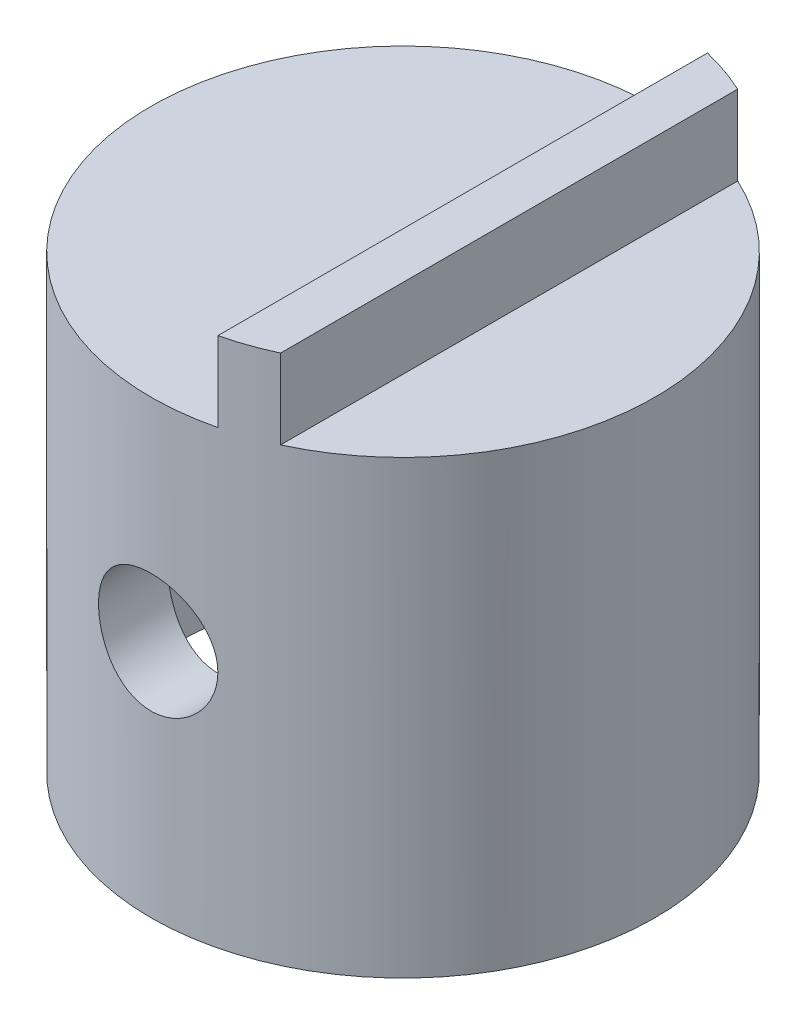
ISO-10303-21;
HEADER;
FILE_DESCRIPTION(('STEP AP214'),'2;1');
FILE_NAME('part.step','',(''),(''),'','','');
FILE_SCHEMA(('AUTOMOTIVE_DESIGN { 1 0 10303 214 1 1 1 1 }'));
ENDSEC;
DATA;
#1=APPLICATION_CONTEXT('core data for automotive mechanical design processes');
#2=APPLICATION_PROTOCOL_DEFINITION('international standard','automotive_design',2000,#1);
#3=PRODUCT_CONTEXT('',#1,'mechanical');
#4=PRODUCT('Part','Part','',(#3));
#5=PRODUCT_RELATED_PRODUCT_CATEGORY('part','',(#4));
#6=PRODUCT_DEFINITION_FORMATION('','',#4);
#7=PRODUCT_DEFINITION_CONTEXT('part definition',#1,'design');
#8=PRODUCT_DEFINITION('design','',#6,#7);
#9=PRODUCT_DEFINITION_SHAPE('','',#8);
#10=(LENGTH_UNIT() NAMED_UNIT(*) SI_UNIT(.MILLI.,.METRE.));
#11=(NAMED_UNIT(*) PLANE_ANGLE_UNIT() SI_UNIT($,.RADIAN.));
#12=(NAMED_UNIT(*) SI_UNIT($,.STERADIAN.) SOLID_ANGLE_UNIT());
#13=UNCERTAINTY_MEASURE_WITH_UNIT(LENGTH_MEASURE(1.E-05),#10,'distance_accuracy_value','');
#14=(GEOMETRIC_REPRESENTATION_CONTEXT(3) GLOBAL_UNCERTAINTY_ASSIGNED_CONTEXT((#13)) GLOBAL_UNIT_ASSIGNED_CONTEXT((#10,
#11,#12)) REPRESENTATION_CONTEXT('',''));
#15=CARTESIAN_POINT('',(0.,0.,0.));
#16=DIRECTION('',(0.,0.,1.));
#17=DIRECTION('',(1.,0.,0.));
#18=AXIS2_PLACEMENT_3D('',#15,#16,#17);
#19=CARTESIAN_POINT('',(0.,17.,0.));
#20=DIRECTION('',(0.,1.,0.));
#21=DIRECTION('',(0.,0.,1.));
#22=AXIS2_PLACEMENT_3D('',#19,#20,#21);
#23=PLANE('',#22);
#24=DIRECTION('',(0.,0.,1.));
#25=VECTOR('',#24,1.);
#26=CARTESIAN_POINT('',(2.25,17.,-9.22970747098737));
#27=LINE('',#26,#25);
#28=CARTESIAN_POINT('',(2.25,17.,-9.22970747098737));
#29=VERTEX_POINT('',#28);
#30=CARTESIAN_POINT('',(2.25,17.,9.22970747098737));
#31=VERTEX_POINT('',#30);
#32=EDGE_CURVE('E55',#29,#31,#27,.T.);
#33=ORIENTED_EDGE('',*,*,#32,.F.);
#34=CARTESIAN_POINT('',(0.,17.,0.));
#35=DIRECTION('',(0.,1.,0.));
#36=DIRECTION('',(0.,0.,1.));
#37=AXIS2_PLACEMENT_3D('',#34,#35,#36);
#38=CIRCLE('',#37,9.5);
#39=EDGE_CURVE('E48',#29,#31,#38,.T.);
#40=ORIENTED_EDGE('',*,*,#39,.T.);
#41=EDGE_LOOP('',(#33,#40));
#42=FACE_BOUND('',#41,.T.);
#43=ADVANCED_FACE('F34',(#42),#23,.T.);
#44=CARTESIAN_POINT('',(0.,17.,0.));
#45=DIRECTION('',(0.,-1.,0.));
#46=DIRECTION('',(0.,0.,-1.));
#47=AXIS2_PLACEMENT_3D('',#44,#45,#46);
#48=CYLINDRICAL_SURFACE('',#47,9.5);
#49=CARTESIAN_POINT('',(0.,11.25,-9.5));
#50=CARTESIAN_POINT('',(-0.124521863897175,11.2499961503737,-9.49999778014591));
#51=CARTESIAN_POINT('',(-0.249088188404821,11.2396280309679,-9.49752712494055));
#52=CARTESIAN_POINT('',(-0.494664576527935,11.1984832616561,-9.48791023805947));
#53=CARTESIAN_POINT('',(-0.615672345520305,11.1676937324657,-9.480761055789));
#54=CARTESIAN_POINT('',(-0.850548627564486,11.0867387890331,-9.46258067842105));
#55=CARTESIAN_POINT('',(-0.964425063268532,11.0365953366348,-9.4515538846956));
#56=CARTESIAN_POINT('',(-1.1821477312082,10.9184299778384,-9.42679946613872));
#57=CARTESIAN_POINT('',(-1.28599388095224,10.8504079244192,-9.41307181909763));
#58=CARTESIAN_POINT('',(-1.48264397629712,10.6970769106558,-9.38412604548802));
#59=CARTESIAN_POINT('',(-1.57523442101544,10.6114980905591,-9.36888684685691));
#60=CARTESIAN_POINT('',(-1.74489104921866,10.4260612689178,-9.33877914520377));
#61=CARTESIAN_POINT('',(-1.821955648573,10.3262018120692,-9.32391068014384));
#62=CARTESIAN_POINT('',(-1.95934991517716,10.1134151404372,-9.29601760977212));
#63=CARTESIAN_POINT('',(-2.01944579157401,10.0003331298744,-9.28301986999367));
#64=CARTESIAN_POINT('',(-2.11969493785631,9.76531519968497,-9.26064519500415));
#65=CARTESIAN_POINT('',(-2.15985104023712,9.64338054042174,-9.25126774556381));
#66=CARTESIAN_POINT('',(-2.21836228054517,9.39645286169196,-9.23741117131147));
#67=CARTESIAN_POINT('',(-2.23709879698116,9.27155512227433,-9.23284647317642));
#68=CARTESIAN_POINT('',(-2.25342606419925,9.02031209493352,-9.22887572555513));
#69=CARTESIAN_POINT('',(-2.25101988347755,8.89396701972415,-9.22946892748892));
#70=CARTESIAN_POINT('',(-2.22543548348135,8.64629988926208,-9.23566979032183));
#71=CARTESIAN_POINT('',(-2.20270665796191,8.52492827594527,-9.24116895989923));
#72=CARTESIAN_POINT('',(-2.13783689546698,8.28777156774136,-9.25638984362656));
#73=CARTESIAN_POINT('',(-2.09569470270775,8.17198683478559,-9.26611183093367));
#74=CARTESIAN_POINT('',(-1.99279869774224,7.94806023440692,-9.28878568097973));
#75=CARTESIAN_POINT('',(-1.93187758767104,7.8399982830018,-9.30176637375997));
#76=CARTESIAN_POINT('',(-1.79327033578444,7.63546751244213,-9.32947816196242));
#77=CARTESIAN_POINT('',(-1.71558153997627,7.5390005323096,-9.34420953431648));
#78=CARTESIAN_POINT('',(-1.54329409824453,7.35781733727136,-9.37422345419306));
#79=CARTESIAN_POINT('',(-1.44831491575896,7.27346330467785,-9.38951047988488));
#80=CARTESIAN_POINT('',(-1.24537916830417,7.12181587652219,-9.41857321261228));
#81=CARTESIAN_POINT('',(-1.13742228285395,7.05452290240607,-9.43234888230924));
#82=CARTESIAN_POINT('',(-0.91111154359382,6.93879402183447,-9.45689433098136));
#83=CARTESIAN_POINT('',(-0.792729156295195,6.89041197005719,-9.46765550093533));
#84=CARTESIAN_POINT('',(-0.549201333713713,6.81433220959535,-9.48489637393271));
#85=CARTESIAN_POINT('',(-0.424057059962553,6.78663096047621,-9.49137680979131));
#86=CARTESIAN_POINT('',(-0.173658792784368,6.75324074591316,-9.49921939695592));
#87=CARTESIAN_POINT('',(-0.0484741576005757,6.74705791834838,-9.50069635980613));
#88=CARTESIAN_POINT('',(0.201140016084546,6.75553247877613,-9.49869029177098));
#89=CARTESIAN_POINT('',(0.325569614370746,6.77018819453545,-9.49520765887889));
#90=CARTESIAN_POINT('',(0.568460248232152,6.81951553813045,-9.4837468124882));
#91=CARTESIAN_POINT('',(0.686978142300745,6.85392226398561,-9.47582812887723));
#92=CARTESIAN_POINT('',(0.916557060159028,6.94147610741373,-9.45638449562114));
#93=CARTESIAN_POINT('',(1.0276173772562,6.99462499805073,-9.44485920479196));
#94=CARTESIAN_POINT('',(1.24112733534557,7.11914270868345,-9.41920188626547));
#95=CARTESIAN_POINT('',(1.3434073704625,7.19079404755374,-9.40503047757712));
#96=CARTESIAN_POINT('',(1.53466832411548,7.34991696514335,-9.37572244408147));
#97=CARTESIAN_POINT('',(1.6236471919022,7.4373909787881,-9.36058567094826));
#98=CARTESIAN_POINT('',(1.78777973532984,7.62795851967428,-9.3306467718057));
#99=CARTESIAN_POINT('',(1.86258876989616,7.73135162457607,-9.31585918897744));
#100=CARTESIAN_POINT('',(1.99378826449349,7.9495200545043,-9.28866596427086));
#101=CARTESIAN_POINT('',(2.05017954851867,8.06429487002332,-9.27626021584158));
#102=CARTESIAN_POINT('',(2.1425353233304,8.30134206769248,-9.25536523639409));
#103=CARTESIAN_POINT('',(2.17861982562254,8.42356556574479,-9.24685305191906));
#104=CARTESIAN_POINT('',(2.22967178760064,8.67257324168974,-9.23467732604892));
#105=CARTESIAN_POINT('',(2.24464331035334,8.79935653725922,-9.23101285174936));
#106=CARTESIAN_POINT('',(2.25284878770318,9.05039254447698,-9.22901328645058));
#107=CARTESIAN_POINT('',(2.24663152566523,9.17462654991455,-9.23054364662708));
#108=CARTESIAN_POINT('',(2.21387919741185,9.42022140489971,-9.2384531896562));
#109=CARTESIAN_POINT('',(2.1873444615991,9.54158230113671,-9.24483229365854));
#110=CARTESIAN_POINT('',(2.11499553513759,9.77745934507233,-9.26164956320364));
#111=CARTESIAN_POINT('',(2.06927425452472,9.89200548082024,-9.27206814947007));
#112=CARTESIAN_POINT('',(1.95992558249034,10.1118779176285,-9.29579518171453));
#113=CARTESIAN_POINT('',(1.89629596759437,10.217203071694,-9.30910398649127));
#114=CARTESIAN_POINT('',(1.75117307375904,10.4183192487892,-9.33750352912181));
#115=CARTESIAN_POINT('',(1.66929443462535,10.5138273683894,-9.35262884729911));
#116=CARTESIAN_POINT('',(1.49076199952812,10.6899271999249,-9.38273993278095));
#117=CARTESIAN_POINT('',(1.39410474872197,10.7705154142224,-9.39772566658308));
#118=CARTESIAN_POINT('',(1.18691678623682,10.9157200326945,-9.42615092989844));
#119=CARTESIAN_POINT('',(1.07619106258127,10.9800640655305,-9.43956229939399));
#120=CARTESIAN_POINT('',(0.845192664111041,11.0891231515422,-9.46303764495673));
#121=CARTESIAN_POINT('',(0.724927431846853,11.1338533326299,-9.4731041993799));
#122=CARTESIAN_POINT('',(0.503935029059565,11.1951873592208,-9.48713151542475));
#123=CARTESIAN_POINT('',(0.404327135141075,11.215700009255,-9.49192549926781));
#124=CARTESIAN_POINT('',(0.203155946656892,11.2431074888882,-9.49836055191313));
#125=CARTESIAN_POINT('',(0.101592770537468,11.2500031407674,-9.50000181109663));
#126=CARTESIAN_POINT('',(0.,11.25,-9.5));
#127=B_SPLINE_CURVE_WITH_KNOTS('',3,(#49,#50,#51,#52,#53,#54,#55,#56,#57,#58,#59,#60,#61,#62,
#63,#64,#65,#66,#67,#68,#69,#70,#71,#72,#73,#74,#75,#76,#77,#78,#79,#80,#81,#82,#83,#84,#85,#86,
#87,#88,#89,#90,#91,#92,#93,#94,#95,#96,#97,#98,#99,#100,#101,#102,#103,#104,#105,#106,#107,
#108,#109,#110,#111,#112,#113,#114,#115,#116,#117,#118,#119,#120,#121,#122,#123,#124,#125,#126),
.UNSPECIFIED.,.T.,.F.,(4,2,2,2,2,2,2,2,2,2,2,2,2,2,2,2,2,2,2,2,2,2,2,2,2,2,2,2,2,2,2,2,2,2,2,2,
2,2,4),(0.,0.373193483221535,0.74662255454218,1.11962911755113,1.49263874799856,
1.87188109444781,2.25116211611593,2.63543877469475,3.01966083017445,3.39692966377169,
3.77414374423823,4.1432173169321,4.51231476707498,4.88480042053213,5.25734507438841,
5.63938537386875,6.02143510967362,6.40456505791057,6.787629401452,7.16184200180051,
7.53602457435784,7.90530208176371,8.27461453328679,8.64993905381035,9.02532138162226,
9.40890751099062,9.792476476697,10.1737541106674,10.554958360018,10.9263653619244,
11.2977663241397,11.6673891763827,12.0370579407576,12.4154314111572,12.7938934707404,
13.178333160474,13.5624758130099,13.8669689228978,14.1714436450102),.UNSPECIFIED.);
#128=CARTESIAN_POINT('',(0.,11.25,-9.5));
#129=VERTEX_POINT('',#128);
#130=EDGE_CURVE('E186',#129,#129,#127,.T.);
#131=ORIENTED_EDGE('',*,*,#130,.T.);
#132=EDGE_LOOP('',(#131));
#133=FACE_BOUND('',#132,.T.);
#134=CARTESIAN_POINT('',(2.25,9.,9.22970747098737));
#135=CARTESIAN_POINT('',(2.24999611442214,8.87553336355061,9.22970994318355));
#136=CARTESIAN_POINT('',(2.23963687591516,8.75102218457137,9.2322526667603));
#137=CARTESIAN_POINT('',(2.19853057414555,8.50556022943455,9.24212606879303));
#138=CARTESIAN_POINT('',(2.16777040134303,8.3846117949079,9.24945982589811));
#139=CARTESIAN_POINT('',(2.08690125560379,8.14986129794313,9.26803917163333));
#140=CARTESIAN_POINT('',(2.0368156166606,8.03605080891436,9.27928004111279));
#141=CARTESIAN_POINT('',(1.91878661569883,7.81843969925569,9.30440126752905));
#142=CARTESIAN_POINT('',(1.85084297942545,7.71463923238852,9.31828166500159));
#143=CARTESIAN_POINT('',(1.6975930507226,7.51794201822874,9.34742493993943));
#144=CARTESIAN_POINT('',(1.61199925402773,7.42527222208057,9.36270802627148));
#145=CARTESIAN_POINT('',(1.42649860107276,7.25546117445896,9.39275866444044));
#146=CARTESIAN_POINT('',(1.32659050999692,7.17832126404585,9.40752617166434));
#147=CARTESIAN_POINT('',(1.11375682043015,7.04084453461498,9.43510385208277));
#148=CARTESIAN_POINT('',(1.00068476430616,6.98072864991775,9.4478873949159));
#149=CARTESIAN_POINT('',(0.765688234861397,6.88043982061273,9.46982722490012));
#150=CARTESIAN_POINT('',(0.643764932650029,6.84026424319296,9.47898399087924));
#151=CARTESIAN_POINT('',(0.396890345908396,6.78171770480134,9.49249570840639));
#152=CARTESIAN_POINT('',(0.272035044849089,6.76296187866105,9.49693531180509));
#153=CARTESIAN_POINT('',(0.0208764710934931,6.74658125761243,9.50080673419306));
#154=CARTESIAN_POINT('',(-0.10542660639136,6.74895364658073,9.50023922056768));
#155=CARTESIAN_POINT('',(-0.353233250933663,6.77448101292812,9.49422410135968));
#156=CARTESIAN_POINT('',(-0.47478230382587,6.79722083262706,9.48887398574258));
#157=CARTESIAN_POINT('',(-0.712288042033562,6.86217275878706,9.47400722984977));
#158=CARTESIAN_POINT('',(-0.828244447485218,6.90438583860264,9.46449038130462));
#159=CARTESIAN_POINT('',(-1.05239259196534,7.00743542216372,9.44220698787272));
#160=CARTESIAN_POINT('',(-1.16051176333364,7.06842383766035,9.42941408379165));
#161=CARTESIAN_POINT('',(-1.3651291884166,7.2071785218519,9.40197295463057));
#162=CARTESIAN_POINT('',(-1.46162560471189,7.28494743793408,9.38732443694914));
#163=CARTESIAN_POINT('',(-1.6427317853729,7.45729656759466,9.35735402725222));
#164=CARTESIAN_POINT('',(-1.7269950581515,7.5522398970957,9.34202442361494));
#165=CARTESIAN_POINT('',(-1.87847580464742,7.75507002465211,9.3127492245575));
#166=CARTESIAN_POINT('',(-1.94569263989652,7.86295730729572,9.29880368098871));
#167=CARTESIAN_POINT('',(-2.06136414788159,8.08923993805708,9.27385084359881));
#168=CARTESIAN_POINT('',(-2.10974329479851,8.20767529310845,9.26285543136379));
#169=CARTESIAN_POINT('',(-2.1858014959774,8.45131950439211,9.2452048394907));
#170=CARTESIAN_POINT('',(-2.21348447098912,8.57652707285239,9.23854883781126));
#171=CARTESIAN_POINT('',(-2.24680609562283,8.82696874563311,9.23050116754752));
#172=CARTESIAN_POINT('',(-2.25295365178635,8.95213131536519,9.22898799421141));
#173=CARTESIAN_POINT('',(-2.24441646736499,9.20169329827535,9.23106785829184));
#174=CARTESIAN_POINT('',(-2.22973342849409,9.32609277295919,9.23466047860078));
#175=CARTESIAN_POINT('',(-2.18039610669635,9.56875947229109,9.24643142594538));
#176=CARTESIAN_POINT('',(-2.14603107891579,9.68708903334103,9.25454329009004));
#177=CARTESIAN_POINT('',(-2.05862267554945,9.91630948418127,9.27437699203827));
#178=CARTESIAN_POINT('',(-2.0055772666599,10.0271995626412,9.28609922280204));
#179=CARTESIAN_POINT('',(-1.88122443404296,10.2405696737142,9.31209351901322));
#180=CARTESIAN_POINT('',(-1.80960871682594,10.3428648455253,9.32640726220448));
#181=CARTESIAN_POINT('',(-1.65054384653404,10.5341725611691,9.35586626748456));
#182=CARTESIAN_POINT('',(-1.56309236988132,10.6231831522568,9.37101165137233));
#183=CARTESIAN_POINT('',(-1.37251691579585,10.7874187864699,9.40083433671798));
#184=CARTESIAN_POINT('',(-1.26908813828952,10.862293967371,9.41549378538325));
#185=CARTESIAN_POINT('',(-1.05082735068887,10.9936095745144,9.4423425732667));
#186=CARTESIAN_POINT('',(-0.935995914844548,11.0500509284905,9.45453203678206));
#187=CARTESIAN_POINT('',(-0.698957059238146,11.1424339683329,9.47499330478872));
#188=CARTESIAN_POINT('',(-0.576807021160402,11.1785166561699,9.48329198692423));
#189=CARTESIAN_POINT('',(-0.32795705223763,11.2295897370148,9.495153733909));
#190=CARTESIAN_POINT('',(-0.201257907878925,11.2445837581661,9.49871761333894));
#191=CARTESIAN_POINT('',(0.0497924168879262,11.2528674753175,9.5006788882504));
#192=CARTESIAN_POINT('',(0.174125787065039,11.2466760142513,9.49919979190441));
#193=CARTESIAN_POINT('',(0.419926386963342,11.2139407608785,9.49151114831554));
#194=CARTESIAN_POINT('',(0.541393686398844,11.1873974641371,9.4853017162559));
#195=CARTESIAN_POINT('',(0.777532418973878,11.114977948306,9.46886495175097));
#196=CARTESIAN_POINT('',(0.892231260565642,11.0691868239165,9.45865531753577));
#197=CARTESIAN_POINT('',(1.1123808694201,10.9596505033243,9.43529954150242));
#198=CARTESIAN_POINT('',(1.2178305792371,10.8959032577127,9.42215306452529));
#199=CARTESIAN_POINT('',(1.41898043072807,10.7506341240923,9.39398981994667));
#200=CARTESIAN_POINT('',(1.51441736791824,10.668754469554,9.37893847805198));
#201=CARTESIAN_POINT('',(1.69037316612785,10.4902513288224,9.34883014616648));
#202=CARTESIAN_POINT('',(1.77088833075469,10.3936242001944,9.33377315569955));
#203=CARTESIAN_POINT('',(1.9159925696545,10.1864752957669,9.3050817215646));
#204=CARTESIAN_POINT('',(1.98030099472034,10.0757529059772,9.29147443102651));
#205=CARTESIAN_POINT('',(2.08929436958755,9.84476619161664,9.26757709463299));
#206=CARTESIAN_POINT('',(2.13399463254112,9.72450939999214,9.25728446184501));
#207=CARTESIAN_POINT('',(2.19526266834053,9.50359116915656,9.24292069983611));
#208=CARTESIAN_POINT('',(2.21574684470599,9.40405272714043,9.23800105101918));
#209=CARTESIAN_POINT('',(2.24311663579617,9.20301931342864,9.23139353752443));
#210=CARTESIAN_POINT('',(2.25000316937342,9.10152447440337,9.22970545447576));
#211=CARTESIAN_POINT('',(2.25,9.,9.22970747098737));
#212=B_SPLINE_CURVE_WITH_KNOTS('',3,(#134,#135,#136,#137,#138,#139,#140,#141,#142,#143,#144,
#145,#146,#147,#148,#149,#150,#151,#152,#153,#154,#155,#156,#157,#158,#159,#160,#161,#162,#163,
#164,#165,#166,#167,#168,#169,#170,#171,#172,#173,#174,#175,#176,#177,#178,#179,#180,#181,#182,
#183,#184,#185,#186,#187,#188,#189,#190,#191,#192,#193,#194,#195,#196,#197,#198,#199,#200,#201,
#202,#203,#204,#205,#206,#207,#208,#209,#210,#211),.UNSPECIFIED.,.T.,.F.,(4,2,2,2,2,2,2,2,2,2,2,
2,2,2,2,2,2,2,2,2,2,2,2,2,2,2,2,2,2,2,2,2,2,2,2,2,2,2,4),(0.,0.373027420685983,
0.746294779505671,1.11911285034635,1.49193664708785,1.87139611483274,2.25088833619768,
2.63510075537306,3.01926243168269,3.39640726591117,3.77350183226427,4.14308057212629,
4.51267778707282,4.88534771947127,5.25807648944326,5.63987753536656,6.02169287939997,
6.40502364718548,6.78828177713612,7.16241961466704,7.53652688951227,7.90527225179186,
8.27405776331646,8.64940847978839,9.02481431608978,9.40855321123804,9.79227279067911,
10.1733010778412,10.5542638039847,10.9259640204221,11.2976551862827,11.6677201062225,
12.0378272803833,12.4160169744681,12.7943002281131,13.1787426030178,13.5628842077035,
13.8671743637011,14.1714439567706),.UNSPECIFIED.);
#213=CARTESIAN_POINT('',(2.25,9.,9.22970747098737));
#214=VERTEX_POINT('',#213);
#215=EDGE_CURVE('E191',#214,#214,#212,.T.);
#216=ORIENTED_EDGE('',*,*,#215,.T.);
#217=EDGE_LOOP('',(#216));
#218=FACE_BOUND('',#217,.T.);
#219=CARTESIAN_POINT('',(4.,17.,8.61684396980704));
#220=VERTEX_POINT('',#219);
#221=CARTESIAN_POINT('',(4.,17.,-8.61684396980704));
#222=VERTEX_POINT('',#221);
#223=EDGE_CURVE('E11',#220,#222,#38,.T.);
#224=ORIENTED_EDGE('',*,*,#223,.F.);
#225=DIRECTION('',(0.,-1.,0.));
#226=VECTOR('',#225,1.);
#227=CARTESIAN_POINT('',(4.,20.,8.61684396980704));
#228=LINE('',#227,#226);
#229=CARTESIAN_POINT('',(4.,20.,8.61684396980704));
#230=VERTEX_POINT('',#229);
#231=EDGE_CURVE('E88',#230,#220,#228,.T.);
#232=ORIENTED_EDGE('',*,*,#231,.F.);
#233=CARTESIAN_POINT('',(0.,20.,0.));
#234=DIRECTION('',(0.,1.,0.));
#235=DIRECTION('',(0.,0.,1.));
#236=AXIS2_PLACEMENT_3D('',#233,#234,#235);
#237=CIRCLE('',#236,9.5);
#238=CARTESIAN_POINT('',(2.25,20.,9.22970747098737));
#239=VERTEX_POINT('',#238);
#240=EDGE_CURVE('E110',#239,#230,#237,.T.);
#241=ORIENTED_EDGE('',*,*,#240,.F.);
#242=DIRECTION('',(0.,-1.,0.));
#243=VECTOR('',#242,1.);
#244=CARTESIAN_POINT('',(2.25,20.,9.22970747098737));
#245=LINE('',#244,#243);
#246=EDGE_CURVE('E99',#239,#31,#245,.T.);
#247=ORIENTED_EDGE('',*,*,#246,.T.);
#248=ORIENTED_EDGE('',*,*,#39,.F.);
#249=DIRECTION('',(0.,-1.,0.));
#250=VECTOR('',#249,1.);
#251=CARTESIAN_POINT('',(2.25,20.,-9.22970747098737));
#252=LINE('',#251,#250);
#253=CARTESIAN_POINT('',(2.25,20.,-9.22970747098737));
#254=VERTEX_POINT('',#253);
#255=EDGE_CURVE('E94',#254,#29,#252,.T.);
#256=ORIENTED_EDGE('',*,*,#255,.F.);
#257=CARTESIAN_POINT('',(0.,20.,0.));
#258=DIRECTION('',(0.,1.,0.));
#259=DIRECTION('',(0.,0.,1.));
#260=AXIS2_PLACEMENT_3D('',#257,#258,#259);
#261=CIRCLE('',#260,9.5);
#262=CARTESIAN_POINT('',(4.,20.,-8.61684396980704));
#263=VERTEX_POINT('',#262);
#264=EDGE_CURVE('E93',#263,#254,#261,.T.);
#265=ORIENTED_EDGE('',*,*,#264,.F.);
#266=DIRECTION('',(0.,-1.,0.));
#267=VECTOR('',#266,1.);
#268=CARTESIAN_POINT('',(4.,20.,-8.61684396980704));
#269=LINE('',#268,#267);
#270=EDGE_CURVE('E86',#263,#222,#269,.T.);
#271=ORIENTED_EDGE('',*,*,#270,.T.);
#272=EDGE_LOOP('',(#224,#232,#241,#247,#248,#256,#265,#271));
#273=FACE_BOUND('',#272,.T.);
#274=CARTESIAN_POINT('',(0.,0.,0.));
#275=DIRECTION('',(0.,1.,0.));
#276=DIRECTION('',(0.,0.,1.));
#277=AXIS2_PLACEMENT_3D('',#274,#275,#276);
#278=CIRCLE('',#277,9.5);
#279=CARTESIAN_POINT('',(0.,0.,9.5));
#280=VERTEX_POINT('',#279);
#281=EDGE_CURVE('E96',#280,#280,#278,.T.);
#282=ORIENTED_EDGE('',*,*,#281,.T.);
#283=EDGE_LOOP('',(#282));
#284=FACE_BOUND('',#283,.T.);
#285=ADVANCED_FACE('F36',(#133,#218,#273,#284),#48,.T.);
#286=DIRECTION('',(0.,0.,-1.));
#287=VECTOR('',#286,1.);
#288=CARTESIAN_POINT('',(4.,17.,8.61684396980704));
#289=LINE('',#288,#287);
#290=EDGE_CURVE('E61',#220,#222,#289,.T.);
#291=ORIENTED_EDGE('',*,*,#290,.F.);
#292=ORIENTED_EDGE('',*,*,#223,.T.);
#293=EDGE_LOOP('',(#291,#292));
#294=FACE_BOUND('',#293,.T.);
#295=ADVANCED_FACE('F78',(#294),#23,.T.);
#296=CARTESIAN_POINT('',(0.,0.,0.));
#297=DIRECTION('',(0.,1.,0.));
#298=DIRECTION('',(0.,0.,1.));
#299=AXIS2_PLACEMENT_3D('',#296,#297,#298);
#300=PLANE('',#299);
#301=CARTESIAN_POINT('',(0.,0.,0.));
#302=DIRECTION('',(0.,-1.,0.));
#303=DIRECTION('',(0.,0.,-1.));
#304=AXIS2_PLACEMENT_3D('',#301,#302,#303);
#305=CIRCLE('',#304,8.5);
#306=CARTESIAN_POINT('',(0.,0.,-8.5));
#307=VERTEX_POINT('',#306);
#308=EDGE_CURVE('E89',#307,#307,#305,.T.);
#309=ORIENTED_EDGE('',*,*,#308,.F.);
#310=EDGE_LOOP('',(#309));
#311=FACE_BOUND('',#310,.T.);
#312=ORIENTED_EDGE('',*,*,#281,.F.);
#313=EDGE_LOOP('',(#312));
#314=FACE_BOUND('',#313,.T.);
#315=ADVANCED_FACE('F156',(#311,#314),#300,.F.);
#316=CARTESIAN_POINT('',(4.,20.,8.61684396980704));
#317=DIRECTION('',(-1.,0.,0.));
#318=DIRECTION('',(0.,0.,1.));
#319=AXIS2_PLACEMENT_3D('',#316,#317,#318);
#320=PLANE('',#319);
#321=ORIENTED_EDGE('',*,*,#290,.T.);
#322=ORIENTED_EDGE('',*,*,#270,.F.);
#323=DIRECTION('',(0.,0.,-1.));
#324=VECTOR('',#323,1.);
#325=CARTESIAN_POINT('',(4.,20.,8.61684396980704));
#326=LINE('',#325,#324);
#327=EDGE_CURVE('E118',#230,#263,#326,.T.);
#328=ORIENTED_EDGE('',*,*,#327,.F.);
#329=ORIENTED_EDGE('',*,*,#231,.T.);
#330=EDGE_LOOP('',(#321,#322,#328,#329));
#331=FACE_BOUND('',#330,.T.);
#332=ADVANCED_FACE('F85',(#331),#320,.F.);
#333=CARTESIAN_POINT('',(2.25,20.,-9.22970747098737));
#334=DIRECTION('',(1.,0.,0.));
#335=DIRECTION('',(0.,0.,-1.));
#336=AXIS2_PLACEMENT_3D('',#333,#334,#335);
#337=PLANE('',#336);
#338=ORIENTED_EDGE('',*,*,#32,.T.);
#339=ORIENTED_EDGE('',*,*,#246,.F.);
#340=DIRECTION('',(0.,0.,1.));
#341=VECTOR('',#340,1.);
#342=CARTESIAN_POINT('',(2.25,20.,-9.22970747098737));
#343=LINE('',#342,#341);
#344=EDGE_CURVE('E121',#254,#239,#343,.T.);
#345=ORIENTED_EDGE('',*,*,#344,.F.);
#346=ORIENTED_EDGE('',*,*,#255,.T.);
#347=EDGE_LOOP('',(#338,#339,#345,#346));
#348=FACE_BOUND('',#347,.T.);
#349=ADVANCED_FACE('F133',(#348),#337,.F.);
#350=CARTESIAN_POINT('',(0.,20.,0.));
#351=DIRECTION('',(0.,1.,0.));
#352=DIRECTION('',(0.,0.,1.));
#353=AXIS2_PLACEMENT_3D('',#350,#351,#352);
#354=PLANE('',#353);
#355=ORIENTED_EDGE('',*,*,#240,.T.);
#356=ORIENTED_EDGE('',*,*,#327,.T.);
#357=ORIENTED_EDGE('',*,*,#264,.T.);
#358=ORIENTED_EDGE('',*,*,#344,.T.);
#359=EDGE_LOOP('',(#355,#356,#357,#358));
#360=FACE_BOUND('',#359,.T.);
#361=ADVANCED_FACE('F137',(#360),#354,.T.);
#362=CARTESIAN_POINT('',(0.,0.,0.));
#363=DIRECTION('',(0.,-1.,0.));
#364=DIRECTION('',(0.,0.,-1.));
#365=AXIS2_PLACEMENT_3D('',#362,#363,#364);
#366=CYLINDRICAL_SURFACE('',#365,8.5);
#367=CARTESIAN_POINT('',(0.,5.,0.));
#368=DIRECTION('',(0.,-1.,0.));
#369=DIRECTION('',(0.,0.,-1.));
#370=AXIS2_PLACEMENT_3D('',#367,#368,#369);
#371=CIRCLE('',#370,8.5);
#372=CARTESIAN_POINT('',(0.,5.,-8.5));
#373=VERTEX_POINT('',#372);
#374=EDGE_CURVE('E170',#373,#373,#371,.T.);
#375=ORIENTED_EDGE('',*,*,#374,.F.);
#376=EDGE_LOOP('',(#375));
#377=FACE_BOUND('',#376,.T.);
#378=ORIENTED_EDGE('',*,*,#308,.T.);
#379=EDGE_LOOP('',(#378));
#380=FACE_BOUND('',#379,.T.);
#381=ADVANCED_FACE('F139',(#377,#380),#366,.F.);
#382=CARTESIAN_POINT('',(8.5,5.,0.));
#383=DIRECTION('',(0.,1.,0.));
#384=DIRECTION('',(0.,0.,1.));
#385=AXIS2_PLACEMENT_3D('',#382,#383,#384);
#386=PLANE('',#385);
#387=CARTESIAN_POINT('',(0.,5.,0.));
#388=DIRECTION('',(0.,-1.,0.));
#389=DIRECTION('',(0.,0.,-1.));
#390=AXIS2_PLACEMENT_3D('',#387,#388,#389);
#391=CIRCLE('',#390,7.);
#392=CARTESIAN_POINT('',(0.,5.,-7.));
#393=VERTEX_POINT('',#392);
#394=EDGE_CURVE('E172',#393,#393,#391,.T.);
#395=ORIENTED_EDGE('',*,*,#394,.F.);
#396=EDGE_LOOP('',(#395));
#397=FACE_BOUND('',#396,.T.);
#398=ORIENTED_EDGE('',*,*,#374,.T.);
#399=EDGE_LOOP('',(#398));
#400=FACE_BOUND('',#399,.T.);
#401=ADVANCED_FACE('F145',(#397,#400),#386,.F.);
#402=CARTESIAN_POINT('',(0.,0.,0.));
#403=DIRECTION('',(0.,-1.,0.));
#404=DIRECTION('',(0.,0.,-1.));
#405=AXIS2_PLACEMENT_3D('',#402,#403,#404);
#406=CYLINDRICAL_SURFACE('',#405,7.);
#407=CARTESIAN_POINT('',(0.,11.25,-7.));
#408=CARTESIAN_POINT('',(0.123012143178424,11.249999749366,-6.99999976179669));
#409=CARTESIAN_POINT('',(0.246027731603366,11.2398789366997,-6.99672711918598));
#410=CARTESIAN_POINT('',(0.488450415895989,11.1997766640114,-6.98399324339077));
#411=CARTESIAN_POINT('',(0.607856879475368,11.1697917448116,-6.97453093232782));
#412=CARTESIAN_POINT('',(0.839530929817574,11.091084755736,-6.95044908640445));
#413=CARTESIAN_POINT('',(0.951809608785071,11.0423926742868,-6.93583780865707));
#414=CARTESIAN_POINT('',(1.16660800144767,10.9277845045607,-6.90295935134021));
#415=CARTESIAN_POINT('',(1.26912600487528,10.8618654053123,-6.88469153280425));
#416=CARTESIAN_POINT('',(1.464822457789,10.7124231122269,-6.84576857061176));
#417=CARTESIAN_POINT('',(1.55763973050051,10.6284411417763,-6.82505920252445));
#418=CARTESIAN_POINT('',(1.72814440824907,10.4462332467192,-6.78389456329116));
#419=CARTESIAN_POINT('',(1.8058287858945,10.3480044788311,-6.76343934375324));
#420=CARTESIAN_POINT('',(1.94586414852996,10.136912154499,-6.72451100152702));
#421=CARTESIAN_POINT('',(2.00775624579973,10.023730728749,-6.70610445372413));
#422=CARTESIAN_POINT('',(2.11147579892228,9.7878783263092,-6.67417683535745));
#423=CARTESIAN_POINT('',(2.15330889018187,9.66521002613579,-6.66065439290961));
#424=CARTESIAN_POINT('',(2.21438726510305,9.41795531709021,-6.64059482255277));
#425=CARTESIAN_POINT('',(2.23430545267501,9.29355244979975,-6.63385018439158));
#426=CARTESIAN_POINT('',(2.2530914788999,9.04300183096101,-6.62749472377143));
#427=CARTESIAN_POINT('',(2.25196529001026,8.91685458462823,-6.62788187728806));
#428=CARTESIAN_POINT('',(2.22921920804701,8.67203396479298,-6.63556364281566));
#429=CARTESIAN_POINT('',(2.20846414824337,8.55326953387522,-6.64256674701482));
#430=CARTESIAN_POINT('',(2.14845532401578,8.32100727044856,-6.66221633070727));
#431=CARTESIAN_POINT('',(2.1091994893925,8.20751002888913,-6.67486344174512));
#432=CARTESIAN_POINT('',(2.01271168771254,7.98698403288538,-6.7045927651104));
#433=CARTESIAN_POINT('',(1.95521465531371,7.88008035284777,-6.72173968566914));
#434=CARTESIAN_POINT('',(1.82406062039451,7.67715924241944,-6.75850802668046));
#435=CARTESIAN_POINT('',(1.75039921844913,7.58114478653969,-6.7781301201767));
#436=CARTESIAN_POINT('',(1.58480163262199,7.39785060269166,-6.81879784164673));
#437=CARTESIAN_POINT('',(1.49215436817144,7.31121716094636,-6.83986643945718));
#438=CARTESIAN_POINT('',(1.29338533894523,7.15455469981848,-6.88021987726771));
#439=CARTESIAN_POINT('',(1.18726245801893,7.08452705723079,-6.89950456928251));
#440=CARTESIAN_POINT('',(0.963256514351006,6.96259181144464,-6.93434047806666));
#441=CARTESIAN_POINT('',(0.845279584796506,6.91084634523591,-6.94985792389322));
#442=CARTESIAN_POINT('',(0.601679398375733,6.82813151104998,-6.97516666215313));
#443=CARTESIAN_POINT('',(0.47605861785344,6.79715545317759,-6.98495979827513));
#444=CARTESIAN_POINT('',(0.226216336150907,6.75797816646447,-6.99741612420055));
#445=CARTESIAN_POINT('',(0.10214536280258,6.74890271734222,-7.00035284167113));
#446=CARTESIAN_POINT('',(-0.14576444289499,6.75130869012733,-6.99957920738421));
#447=CARTESIAN_POINT('',(-0.269603308352119,6.76278691459596,-6.99586988951925));
#448=CARTESIAN_POINT('',(-0.510108118323255,6.80527665941982,-6.98240109313698));
#449=CARTESIAN_POINT('',(-0.62687722125835,6.83576108355046,-6.97280498396755));
#450=CARTESIAN_POINT('',(-0.853604953836259,6.91474806098995,-6.94869538538637));
#451=CARTESIAN_POINT('',(-0.963562727057793,6.9632528747456,-6.93418127908958));
#452=CARTESIAN_POINT('',(-1.17663490423924,7.07826720175951,-6.90126456896943));
#453=CARTESIAN_POINT('',(-1.27950666005376,7.14520009268395,-6.88277309836884));
#454=CARTESIAN_POINT('',(-1.47284781140805,7.29466720358599,-6.84400893070231));
#455=CARTESIAN_POINT('',(-1.56331364803176,7.37720588434829,-6.82373572523126));
#456=CARTESIAN_POINT('',(-1.73323011818239,7.55965435013584,-6.78261621160081));
#457=CARTESIAN_POINT('',(-1.81205719949494,7.66014886950605,-6.76178167598475));
#458=CARTESIAN_POINT('',(-1.95179347695776,7.87339049115528,-6.72278090819478));
#459=CARTESIAN_POINT('',(-2.01270279226426,7.98613751194622,-6.70461465827671));
#460=CARTESIAN_POINT('',(-2.11453195616,8.22056007607412,-6.67320030704004));
#461=CARTESIAN_POINT('',(-2.15551511354017,8.34220591024647,-6.65993666194711));
#462=CARTESIAN_POINT('',(-2.21625307485895,8.59119064012093,-6.63997472460799));
#463=CARTESIAN_POINT('',(-2.23601657015811,8.71852718268823,-6.633273744459));
#464=CARTESIAN_POINT('',(-2.25310680446811,8.96872932354124,-6.62748686812742));
#465=CARTESIAN_POINT('',(-2.2514614429892,9.09151747219143,-6.62805208507189));
#466=CARTESIAN_POINT('',(-2.22828247020645,9.33497340972778,-6.63588000434046));
#467=CARTESIAN_POINT('',(-2.20674989023492,9.45564130823741,-6.64314235935729));
#468=CARTESIAN_POINT('',(-2.14511292310758,9.6894760591372,-6.66329558960227));
#469=CARTESIAN_POINT('',(-2.1053189430515,9.80273348084019,-6.67609219223373));
#470=CARTESIAN_POINT('',(-2.00853592178791,10.0210532814156,-6.70584332381232));
#471=CARTESIAN_POINT('',(-1.95154324202282,10.1261139202512,-6.72279873245439));
#472=CARTESIAN_POINT('',(-1.81924662511816,10.3297296453881,-6.75982528198024));
#473=CARTESIAN_POINT('',(-1.74328696498192,10.4278405471389,-6.77999576274104));
#474=CARTESIAN_POINT('',(-1.57634721431859,10.6102557184266,-6.82074057430179));
#475=CARTESIAN_POINT('',(-1.48536301190783,10.6945561957403,-6.84131501429446));
#476=CARTESIAN_POINT('',(-1.28709955752092,10.8499423519224,-6.88142022377163));
#477=CARTESIAN_POINT('',(-1.17935881673887,10.9204571854093,-6.90088860302281));
#478=CARTESIAN_POINT('',(-0.952929957180073,11.0422873929204,-6.93577806958912));
#479=CARTESIAN_POINT('',(-0.834245536870043,11.0936092238784,-6.95120051751932));
#480=CARTESIAN_POINT('',(-0.597599112109235,11.1725245187668,-6.97538880722539));
#481=CARTESIAN_POINT('',(-0.480133196754502,11.2014902972696,-6.98453492250922));
#482=CARTESIAN_POINT('',(-0.241778764137127,11.240225939076,-6.99683994291573));
#483=CARTESIAN_POINT('',(-0.120891045797636,11.2500002463123,-7.00000023409597));
#484=CARTESIAN_POINT('',(0.,11.25,-7.));
#485=B_SPLINE_CURVE_WITH_KNOTS('',3,(#407,#408,#409,#410,#411,#412,#413,#414,#415,#416,#417,
#418,#419,#420,#421,#422,#423,#424,#425,#426,#427,#428,#429,#430,#431,#432,#433,#434,#435,#436,
#437,#438,#439,#440,#441,#442,#443,#444,#445,#446,#447,#448,#449,#450,#451,#452,#453,#454,#455,
#456,#457,#458,#459,#460,#461,#462,#463,#464,#465,#466,#467,#468,#469,#470,#471,#472,#473,#474,
#475,#476,#477,#478,#479,#480,#481,#482,#483,#484),.UNSPECIFIED.,.T.,.F.,(4,2,2,2,2,2,2,2,2,2,2,
2,2,2,2,2,2,2,2,2,2,2,2,2,2,2,2,2,2,2,2,2,2,2,2,2,2,2,4),(0.,0.368591855622267,
0.737247915495293,1.10531545238423,1.47344736390484,1.85235395617011,2.23133627242926,
2.62032261521344,3.00919961147719,3.38577050453729,3.76223452726716,4.12284845914372,
4.48350275257514,4.84965828696255,5.21591360106383,5.59986733705715,5.98385289571999,
6.3711630877316,6.75834846583992,7.12980223142826,7.50119821671413,7.8627263336638,
8.22429981540126,8.5949956793544,8.96579766425665,9.35219985603775,9.73859947811957,
10.1237632875873,10.5087692775726,10.875361132233,11.2419339768547,11.6024943031301,
11.9631309631031,12.3385739905136,12.7141199391555,13.1029092752952,13.4915676965282,
13.8538878337016,14.2161240629658),.UNSPECIFIED.);
#486=CARTESIAN_POINT('',(0.,11.25,-7.));
#487=VERTEX_POINT('',#486);
#488=EDGE_CURVE('E39',#487,#487,#485,.T.);
#489=ORIENTED_EDGE('',*,*,#488,.T.);
#490=EDGE_LOOP('',(#489));
#491=FACE_BOUND('',#490,.T.);
#492=CARTESIAN_POINT('',(2.25,9.,6.62853679178143));
#493=CARTESIAN_POINT('',(2.24999973397483,9.12282669483706,6.62853710184911));
#494=CARTESIAN_POINT('',(2.23990831022446,9.24565683521784,6.63198809598701));
#495=CARTESIAN_POINT('',(2.1999333617533,9.4876956931836,6.64535372844153));
#496=CARTESIAN_POINT('',(2.17004538892178,9.60690359058509,6.65526981940078));
#497=CARTESIAN_POINT('',(2.09162150839264,9.83815533101219,6.68032897929812));
#498=CARTESIAN_POINT('',(2.04312008095807,9.95021197628265,6.69546237825992));
#499=CARTESIAN_POINT('',(1.9289622994797,10.1646311777554,6.72923730407521));
#500=CARTESIAN_POINT('',(1.86330258816214,10.2669918314463,6.74787951728054));
#501=CARTESIAN_POINT('',(1.71413525899675,10.4628349630739,6.78733173993455));
#502=CARTESIAN_POINT('',(1.63011037433463,10.5559132341338,6.80819297067235));
#503=CARTESIAN_POINT('',(1.44770347860769,10.7269303331831,6.84929808308586));
#504=CARTESIAN_POINT('',(1.34931934333239,10.8048669172301,6.86954187288493));
#505=CARTESIAN_POINT('',(1.13806047895868,10.9451931326804,6.90772009162109));
#506=CARTESIAN_POINT('',(1.02489398439683,11.0071634403501,6.92558721338161));
#507=CARTESIAN_POINT('',(0.789071602010572,11.1110314138155,6.95639855478944));
#508=CARTESIAN_POINT('',(0.666418090468891,11.1529340873093,6.96934400242998));
#509=CARTESIAN_POINT('',(0.419338067159173,11.2141188422081,6.98849073521196));
#510=CARTESIAN_POINT('',(0.295099032149798,11.2340924483957,6.99489771452445));
#511=CARTESIAN_POINT('',(0.044878872471069,11.2530463981718,7.00097364210966));
#512=CARTESIAN_POINT('',(-0.0811018266496096,11.2520317823819,7.00064420822851));
#513=CARTESIAN_POINT('',(-0.326350521728299,11.2294861466408,6.9934260394811));
#514=CARTESIAN_POINT('',(-0.44569568754349,11.2087053770762,6.98677717394758));
#515=CARTESIAN_POINT('',(-0.679104732254417,11.1484524139779,6.96796481644));
#516=CARTESIAN_POINT('',(-0.793168259903415,11.1089789792733,6.95580095827919));
#517=CARTESIAN_POINT('',(-1.01446890225394,11.0119978818799,6.92701036208066));
#518=CARTESIAN_POINT('',(-1.12160150110467,10.9542685624896,6.9103291540426));
#519=CARTESIAN_POINT('',(-1.32488731868748,10.8225942175327,6.87425253944426));
#520=CARTESIAN_POINT('',(-1.42103763049462,10.7486449137205,6.85485641727709));
#521=CARTESIAN_POINT('',(-1.6040991207341,10.582807566072,6.81439976805301));
#522=CARTESIAN_POINT('',(-1.69041828486491,10.4902738064461,6.79330355652971));
#523=CARTESIAN_POINT('',(-1.84649645652377,10.2918538169021,6.75255315750024));
#524=CARTESIAN_POINT('',(-1.91625327061894,10.1859658212574,6.73289916123155));
#525=CARTESIAN_POINT('',(-2.03796962995555,9.96208528454601,6.69707188482389));
#526=CARTESIAN_POINT('',(-2.08969714130786,9.84395862670261,6.68094491395509));
#527=CARTESIAN_POINT('',(-2.17233394802429,9.60002579302306,6.6545374911179));
#528=CARTESIAN_POINT('',(-2.20325124167041,9.47422258792109,6.64425479317507));
#529=CARTESIAN_POINT('',(-2.24222133818135,9.22420650623592,6.63120279156749));
#530=CARTESIAN_POINT('',(-2.25118551903234,9.10015124714027,6.62813422424622));
#531=CARTESIAN_POINT('',(-2.248563225334,8.85229626191105,6.62902464320288));
#532=CARTESIAN_POINT('',(-2.23698015530062,8.72849649684681,6.63298246526409));
#533=CARTESIAN_POINT('',(-2.1944085874433,8.48868291243943,6.64718302229486));
#534=CARTESIAN_POINT('',(-2.16403601632919,8.37254668584002,6.65722607426079));
#535=CARTESIAN_POINT('',(-2.08547744627584,8.14703603066764,6.68225050262408));
#536=CARTESIAN_POINT('',(-2.03728843291472,8.03766274999682,6.6972327146475));
#537=CARTESIAN_POINT('',(-1.92281855967105,7.82515091455977,6.73100450759507));
#538=CARTESIAN_POINT('',(-1.85603851074139,7.72229767233913,6.74989478804693));
#539=CARTESIAN_POINT('',(-1.70685771845461,7.52892615194617,6.78915135468425));
#540=CARTESIAN_POINT('',(-1.62445268480902,7.43841127338715,6.80951804530957));
#541=CARTESIAN_POINT('',(-1.44202909742046,7.26815311485444,6.85052237800987));
#542=CARTESIAN_POINT('',(-1.34139276201172,7.18906323454604,6.87113216934906));
#543=CARTESIAN_POINT('',(-1.12777413938865,7.04886090052854,6.90940536791384));
#544=CARTESIAN_POINT('',(-1.0147923713313,6.98774769125323,6.92706889895833));
#545=CARTESIAN_POINT('',(-0.780336110513259,6.88581139070052,6.95736535899947));
#546=CARTESIAN_POINT('',(-0.65892797582684,6.84484661987702,6.97003328722146));
#547=CARTESIAN_POINT('',(-0.410462981002188,6.78406621674739,6.98906421228553));
#548=CARTESIAN_POINT('',(-0.28340801658179,6.76424354178845,6.99542930861611));
#549=CARTESIAN_POINT('',(-0.0332541082095946,6.74690847036097,7.00099007846919));
#550=CARTESIAN_POINT('',(0.0897736296566594,6.74845481573633,7.00048823543379));
#551=CARTESIAN_POINT('',(0.333735894400334,6.77151843396735,6.99310457283613));
#552=CARTESIAN_POINT('',(0.4546705708216,6.79303427400385,6.98622321100693));
#553=CARTESIAN_POINT('',(0.689353923873003,6.85481560864726,6.96695600425205));
#554=CARTESIAN_POINT('',(0.803179067706922,6.8948165910044,6.95464792316913));
#555=CARTESIAN_POINT('',(1.02255301317808,6.99219150877431,6.92579523891081));
#556=CARTESIAN_POINT('',(1.12810035449584,7.0495685009163,6.90924989040868));
#557=CARTESIAN_POINT('',(1.33197397223648,7.18240123069689,6.87291422757443));
#558=CARTESIAN_POINT('',(1.42991459574143,7.25842291248904,6.85303009232523));
#559=CARTESIAN_POINT('',(1.61195919793862,7.42540401789834,6.81251065196244));
#560=CARTESIAN_POINT('',(1.69605890476869,7.51636803607604,6.79187511732778));
#561=CARTESIAN_POINT('',(1.85106841340107,7.71453339755361,6.75131123316886));
#562=CARTESIAN_POINT('',(1.92140134673173,7.82219787338217,6.73143429418086));
#563=CARTESIAN_POINT('',(2.04290919002385,8.04842616712831,6.69556246515116));
#564=CARTESIAN_POINT('',(2.09409072444395,8.16698619857101,6.67956623344939));
#565=CARTESIAN_POINT('',(2.17276508566958,8.40332182418067,6.65437350526039));
#566=CARTESIAN_POINT('',(2.20163903087341,8.52059613693335,6.64478667251888));
#567=CARTESIAN_POINT('',(2.24025389294519,8.75857984963504,6.6318690546864));
#568=CARTESIAN_POINT('',(2.25000026144448,8.87928826086377,6.6285364870528));
#569=CARTESIAN_POINT('',(2.25,9.,6.62853679178143));
#570=B_SPLINE_CURVE_WITH_KNOTS('',3,(#492,#493,#494,#495,#496,#497,#498,#499,#500,#501,#502,
#503,#504,#505,#506,#507,#508,#509,#510,#511,#512,#513,#514,#515,#516,#517,#518,#519,#520,#521,
#522,#523,#524,#525,#526,#527,#528,#529,#530,#531,#532,#533,#534,#535,#536,#537,#538,#539,#540,
#541,#542,#543,#544,#545,#546,#547,#548,#549,#550,#551,#552,#553,#554,#555,#556,#557,#558,#559,
#560,#561,#562,#563,#564,#565,#566,#567,#568,#569),.UNSPECIFIED.,.T.,.F.,(4,2,2,2,2,2,2,2,2,2,2,
2,2,2,2,2,2,2,2,2,2,2,2,2,2,2,2,2,2,2,2,2,2,2,2,2,2,2,4),(0.,0.36803371606576,0.736150154140144,
1.10358794559797,1.47109768563318,1.85072951841003,2.23041756838432,2.61924382166431,
3.00797299621829,3.38405645180652,3.76004958662664,4.12231806059275,4.48461059213303,
4.85148272913003,5.21845175035283,5.60155383503393,5.98470662752968,6.37262271678031,
6.76038962755113,7.13176299761049,7.50307483980542,7.86281647495648,8.22261900384072,
8.59321096377894,8.96390482812936,9.35099247338617,9.73806384687911,10.1223730531128,
10.5065542019174,10.8738690626464,11.2411575704257,11.6033457991055,11.9655977797684,
12.3406181844134,12.7157541192126,13.1042590383688,13.4926294493829,13.8544291174086,
14.2161256524005),.UNSPECIFIED.);
#571=CARTESIAN_POINT('',(2.25,9.,6.62853679178143));
#572=VERTEX_POINT('',#571);
#573=EDGE_CURVE('E204',#572,#572,#570,.T.);
#574=ORIENTED_EDGE('',*,*,#573,.T.);
#575=EDGE_LOOP('',(#574));
#576=FACE_BOUND('',#575,.T.);
#577=CARTESIAN_POINT('',(0.,12.5,0.));
#578=DIRECTION('',(0.,-1.,0.));
#579=DIRECTION('',(0.,0.,-1.));
#580=AXIS2_PLACEMENT_3D('',#577,#578,#579);
#581=CIRCLE('',#580,7.);
#582=CARTESIAN_POINT('',(0.,12.5,-7.));
#583=VERTEX_POINT('',#582);
#584=EDGE_CURVE('E177',#583,#583,#581,.T.);
#585=ORIENTED_EDGE('',*,*,#584,.F.);
#586=EDGE_LOOP('',(#585));
#587=FACE_BOUND('',#586,.T.);
#588=ORIENTED_EDGE('',*,*,#394,.T.);
#589=EDGE_LOOP('',(#588));
#590=FACE_BOUND('',#589,.T.);
#591=ADVANCED_FACE('F211',(#491,#576,#587,#590),#406,.F.);
#592=CARTESIAN_POINT('',(7.,12.5,0.));
#593=DIRECTION('',(0.,-1.,0.));
#594=DIRECTION('',(0.,0.,-1.));
#595=AXIS2_PLACEMENT_3D('',#592,#593,#594);
#596=PLANE('',#595);
#597=CARTESIAN_POINT('',(0.,12.5,0.));
#598=DIRECTION('',(0.,-1.,0.));
#599=DIRECTION('',(0.,0.,-1.));
#600=AXIS2_PLACEMENT_3D('',#597,#598,#599);
#601=CIRCLE('',#600,8.5);
#602=CARTESIAN_POINT('',(0.,12.5,-8.5));
#603=VERTEX_POINT('',#602);
#604=EDGE_CURVE('E180',#603,#603,#601,.T.);
#605=ORIENTED_EDGE('',*,*,#604,.F.);
#606=EDGE_LOOP('',(#605));
#607=FACE_BOUND('',#606,.T.);
#608=ORIENTED_EDGE('',*,*,#584,.T.);
#609=EDGE_LOOP('',(#608));
#610=FACE_BOUND('',#609,.T.);
#611=ADVANCED_FACE('F216',(#607,#610),#596,.F.);
#612=CARTESIAN_POINT('',(0.,0.,0.));
#613=DIRECTION('',(0.,-1.,0.));
#614=DIRECTION('',(0.,0.,-1.));
#615=AXIS2_PLACEMENT_3D('',#612,#613,#614);
#616=CYLINDRICAL_SURFACE('',#615,8.5);
#617=CARTESIAN_POINT('',(0.,15.,0.));
#618=DIRECTION('',(0.,-1.,0.));
#619=DIRECTION('',(0.,0.,-1.));
#620=AXIS2_PLACEMENT_3D('',#617,#618,#619);
#621=CIRCLE('',#620,8.5);
#622=CARTESIAN_POINT('',(0.,15.,-8.5));
#623=VERTEX_POINT('',#622);
#624=EDGE_CURVE('E183',#623,#623,#621,.T.);
#625=ORIENTED_EDGE('',*,*,#624,.F.);
#626=EDGE_LOOP('',(#625));
#627=FACE_BOUND('',#626,.T.);
#628=ORIENTED_EDGE('',*,*,#604,.T.);
#629=EDGE_LOOP('',(#628));
#630=FACE_BOUND('',#629,.T.);
#631=ADVANCED_FACE('F239',(#627,#630),#616,.F.);
#632=CARTESIAN_POINT('',(8.5,15.,0.));
#633=DIRECTION('',(0.,1.,0.));
#634=DIRECTION('',(0.,0.,1.));
#635=AXIS2_PLACEMENT_3D('',#632,#633,#634);
#636=PLANE('',#635);
#637=ORIENTED_EDGE('',*,*,#624,.T.);
#638=EDGE_LOOP('',(#637));
#639=FACE_BOUND('',#638,.T.);
#640=ADVANCED_FACE('F200',(#639),#636,.F.);
#641=CARTESIAN_POINT('',(0.,9.,-9.500025));
#642=DIRECTION('',(0.,0.,1.));
#643=DIRECTION('',(1.,0.,0.));
#644=AXIS2_PLACEMENT_3D('',#641,#642,#643);
#645=CYLINDRICAL_SURFACE('',#644,2.25);
#646=ORIENTED_EDGE('',*,*,#573,.F.);
#647=EDGE_LOOP('',(#646));
#648=FACE_BOUND('',#647,.T.);
#649=ORIENTED_EDGE('',*,*,#215,.F.);
#650=EDGE_LOOP('',(#649));
#651=FACE_BOUND('',#650,.T.);
#652=ADVANCED_FACE('F198',(#648,#651),#645,.F.);
#653=ORIENTED_EDGE('',*,*,#488,.F.);
#654=EDGE_LOOP('',(#653));
#655=FACE_BOUND('',#654,.T.);
#656=ORIENTED_EDGE('',*,*,#130,.F.);
#657=EDGE_LOOP('',(#656));
#658=FACE_BOUND('',#657,.T.);
#659=ADVANCED_FACE('F194',(#655,#658),#645,.F.);
#660=CLOSED_SHELL('',(#43,#285,#295,#315,#332,#349,#361,#381,#401,#591,#611,#631,#640,#652,#659));
#661=MANIFOLD_SOLID_BREP('B2',#660);
#662=ADVANCED_BREP_SHAPE_REPRESENTATION('',(#18,#661),#14);
#663=SHAPE_DEFINITION_REPRESENTATION(#9,#662);
ENDSEC;
END-ISO-10303-21;
